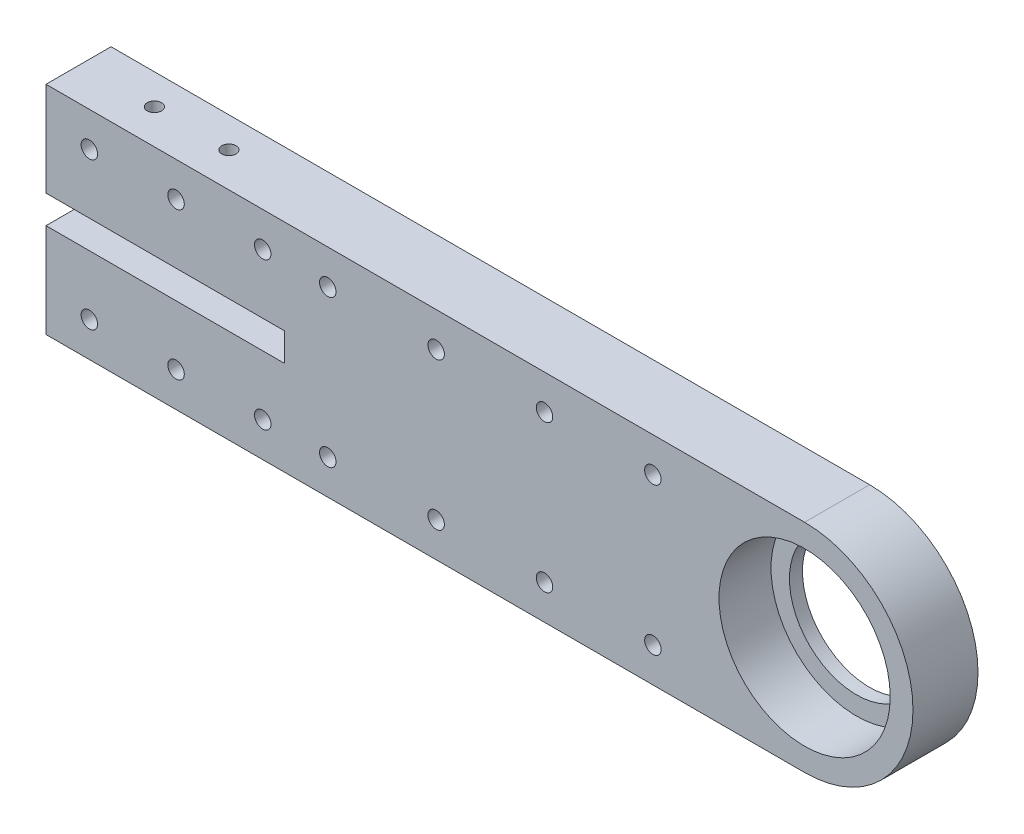
ISO-10303-21;
HEADER;
FILE_DESCRIPTION(('STEP AP214'),'2;1');
FILE_NAME('part.step','',(''),(''),'','','');
FILE_SCHEMA(('AUTOMOTIVE_DESIGN { 1 0 10303 214 1 1 1 1 }'));
ENDSEC;
DATA;
#1=APPLICATION_CONTEXT('core data for automotive mechanical design processes');
#2=APPLICATION_PROTOCOL_DEFINITION('international standard','automotive_design',2000,#1);
#3=PRODUCT_CONTEXT('',#1,'mechanical');
#4=PRODUCT('Part','Part','',(#3));
#5=PRODUCT_RELATED_PRODUCT_CATEGORY('part','',(#4));
#6=PRODUCT_DEFINITION_FORMATION('','',#4);
#7=PRODUCT_DEFINITION_CONTEXT('part definition',#1,'design');
#8=PRODUCT_DEFINITION('design','',#6,#7);
#9=PRODUCT_DEFINITION_SHAPE('','',#8);
#10=(LENGTH_UNIT() NAMED_UNIT(*) SI_UNIT(.MILLI.,.METRE.));
#11=(NAMED_UNIT(*) PLANE_ANGLE_UNIT() SI_UNIT($,.RADIAN.));
#12=(NAMED_UNIT(*) SI_UNIT($,.STERADIAN.) SOLID_ANGLE_UNIT());
#13=UNCERTAINTY_MEASURE_WITH_UNIT(LENGTH_MEASURE(1.E-05),#10,'distance_accuracy_value','');
#14=(GEOMETRIC_REPRESENTATION_CONTEXT(3) GLOBAL_UNCERTAINTY_ASSIGNED_CONTEXT((#13)) GLOBAL_UNIT_ASSIGNED_CONTEXT((#10,
#11,#12)) REPRESENTATION_CONTEXT('',''));
#15=CARTESIAN_POINT('',(0.,0.,0.));
#16=DIRECTION('',(0.,0.,1.));
#17=DIRECTION('',(1.,0.,0.));
#18=AXIS2_PLACEMENT_3D('',#15,#16,#17);
#19=CARTESIAN_POINT('',(0.,0.,15.));
#20=DIRECTION('',(0.,1.,0.));
#21=DIRECTION('',(-1.,0.,0.));
#22=AXIS2_PLACEMENT_3D('',#19,#20,#21);
#23=PLANE('',#22);
#24=DIRECTION('',(1.,0.,0.));
#25=VECTOR('',#24,1.);
#26=CARTESIAN_POINT('',(0.,0.,0.));
#27=LINE('',#26,#25);
#28=CARTESIAN_POINT('',(0.,0.,0.));
#29=VERTEX_POINT('',#28);
#30=CARTESIAN_POINT('',(175.,0.,0.));
#31=VERTEX_POINT('',#30);
#32=EDGE_CURVE('E141',#29,#31,#27,.T.);
#33=ORIENTED_EDGE('',*,*,#32,.T.);
#34=DIRECTION('',(0.,0.,-1.));
#35=VECTOR('',#34,1.);
#36=CARTESIAN_POINT('',(175.,0.,15.));
#37=LINE('',#36,#35);
#38=CARTESIAN_POINT('',(175.,0.,15.));
#39=VERTEX_POINT('',#38);
#40=EDGE_CURVE('E47',#39,#31,#37,.T.);
#41=ORIENTED_EDGE('',*,*,#40,.F.);
#42=DIRECTION('',(1.,0.,0.));
#43=VECTOR('',#42,1.);
#44=CARTESIAN_POINT('',(0.,0.,15.));
#45=LINE('',#44,#43);
#46=CARTESIAN_POINT('',(0.,0.,15.));
#47=VERTEX_POINT('',#46);
#48=EDGE_CURVE('E162',#47,#39,#45,.T.);
#49=ORIENTED_EDGE('',*,*,#48,.F.);
#50=DIRECTION('',(0.,0.,-1.));
#51=VECTOR('',#50,1.);
#52=CARTESIAN_POINT('',(0.,0.,15.));
#53=LINE('',#52,#51);
#54=EDGE_CURVE('E55',#47,#29,#53,.T.);
#55=ORIENTED_EDGE('',*,*,#54,.T.);
#56=EDGE_LOOP('',(#33,#41,#49,#55));
#57=FACE_BOUND('',#56,.T.);
#58=ADVANCED_FACE('F39',(#57),#23,.F.);
#59=CARTESIAN_POINT('',(175.,25.,15.));
#60=DIRECTION('',(0.,0.,-1.));
#61=DIRECTION('',(-1.,0.,0.));
#62=AXIS2_PLACEMENT_3D('',#59,#60,#61);
#63=CYLINDRICAL_SURFACE('',#62,25.);
#64=CARTESIAN_POINT('',(175.,25.,0.));
#65=DIRECTION('',(0.,0.,1.));
#66=DIRECTION('',(1.,0.,0.));
#67=AXIS2_PLACEMENT_3D('',#64,#65,#66);
#68=CIRCLE('',#67,25.);
#69=CARTESIAN_POINT('',(175.,50.,0.));
#70=VERTEX_POINT('',#69);
#71=EDGE_CURVE('E143',#31,#70,#68,.T.);
#72=ORIENTED_EDGE('',*,*,#71,.T.);
#73=DIRECTION('',(0.,0.,-1.));
#74=VECTOR('',#73,1.);
#75=CARTESIAN_POINT('',(175.,50.,15.));
#76=LINE('',#75,#74);
#77=CARTESIAN_POINT('',(175.,50.,15.));
#78=VERTEX_POINT('',#77);
#79=EDGE_CURVE('E170',#78,#70,#76,.T.);
#80=ORIENTED_EDGE('',*,*,#79,.F.);
#81=CARTESIAN_POINT('',(175.,25.,15.));
#82=DIRECTION('',(0.,0.,1.));
#83=DIRECTION('',(1.,0.,0.));
#84=AXIS2_PLACEMENT_3D('',#81,#82,#83);
#85=CIRCLE('',#84,25.);
#86=EDGE_CURVE('E94',#39,#78,#85,.T.);
#87=ORIENTED_EDGE('',*,*,#86,.F.);
#88=ORIENTED_EDGE('',*,*,#40,.T.);
#89=EDGE_LOOP('',(#72,#80,#87,#88));
#90=FACE_BOUND('',#89,.T.);
#91=ADVANCED_FACE('F172',(#90),#63,.T.);
#92=CARTESIAN_POINT('',(0.,50.,15.));
#93=DIRECTION('',(0.,1.,0.));
#94=DIRECTION('',(-1.,0.,0.));
#95=AXIS2_PLACEMENT_3D('',#92,#93,#94);
#96=PLANE('',#95);
#97=CARTESIAN_POINT('',(17.,50.,7.));
#98=DIRECTION('',(0.,1.,0.));
#99=DIRECTION('',(0.,0.,1.));
#100=AXIS2_PLACEMENT_3D('',#97,#98,#99);
#101=CIRCLE('',#100,1.65);
#102=CARTESIAN_POINT('',(17.,50.,8.65));
#103=VERTEX_POINT('',#102);
#104=EDGE_CURVE('E598',#103,#103,#101,.T.);
#105=ORIENTED_EDGE('',*,*,#104,.F.);
#106=EDGE_LOOP('',(#105));
#107=FACE_BOUND('',#106,.T.);
#108=CARTESIAN_POINT('',(34.2,50.,7.));
#109=DIRECTION('',(0.,1.,0.));
#110=DIRECTION('',(0.,0.,1.));
#111=AXIS2_PLACEMENT_3D('',#108,#109,#110);
#112=CIRCLE('',#111,1.65);
#113=CARTESIAN_POINT('',(34.2,50.,8.65));
#114=VERTEX_POINT('',#113);
#115=EDGE_CURVE('E594',#114,#114,#112,.T.);
#116=ORIENTED_EDGE('',*,*,#115,.F.);
#117=EDGE_LOOP('',(#116));
#118=FACE_BOUND('',#117,.T.);
#119=DIRECTION('',(1.,0.,0.));
#120=VECTOR('',#119,1.);
#121=CARTESIAN_POINT('',(0.,50.,0.));
#122=LINE('',#121,#120);
#123=CARTESIAN_POINT('',(0.,50.,0.));
#124=VERTEX_POINT('',#123);
#125=EDGE_CURVE('E147',#124,#70,#122,.T.);
#126=ORIENTED_EDGE('',*,*,#125,.F.);
#127=DIRECTION('',(0.,0.,-1.));
#128=VECTOR('',#127,1.);
#129=CARTESIAN_POINT('',(0.,50.,15.));
#130=LINE('',#129,#128);
#131=CARTESIAN_POINT('',(0.,50.,15.));
#132=VERTEX_POINT('',#131);
#133=EDGE_CURVE('E168',#132,#124,#130,.T.);
#134=ORIENTED_EDGE('',*,*,#133,.F.);
#135=DIRECTION('',(1.,0.,0.));
#136=VECTOR('',#135,1.);
#137=CARTESIAN_POINT('',(0.,50.,15.));
#138=LINE('',#137,#136);
#139=EDGE_CURVE('E613',#132,#78,#138,.T.);
#140=ORIENTED_EDGE('',*,*,#139,.T.);
#141=ORIENTED_EDGE('',*,*,#79,.T.);
#142=EDGE_LOOP('',(#126,#134,#140,#141));
#143=FACE_BOUND('',#142,.T.);
#144=ADVANCED_FACE('F191',(#107,#118,#143),#96,.T.);
#145=CARTESIAN_POINT('',(0.,0.,15.));
#146=DIRECTION('',(-1.,0.,0.));
#147=DIRECTION('',(0.,0.,1.));
#148=AXIS2_PLACEMENT_3D('',#145,#146,#147);
#149=PLANE('',#148);
#150=DIRECTION('',(0.,1.,0.));
#151=VECTOR('',#150,1.);
#152=CARTESIAN_POINT('',(0.,0.,0.));
#153=LINE('',#152,#151);
#154=CARTESIAN_POINT('',(0.,28.25,0.));
#155=VERTEX_POINT('',#154);
#156=EDGE_CURVE('E150',#155,#124,#153,.T.);
#157=ORIENTED_EDGE('',*,*,#156,.F.);
#158=DIRECTION('',(0.,0.,-1.));
#159=VECTOR('',#158,1.);
#160=CARTESIAN_POINT('',(0.,28.25,15.));
#161=LINE('',#160,#159);
#162=CARTESIAN_POINT('',(0.,28.25,15.));
#163=VERTEX_POINT('',#162);
#164=EDGE_CURVE('E166',#163,#155,#161,.T.);
#165=ORIENTED_EDGE('',*,*,#164,.F.);
#166=DIRECTION('',(0.,1.,0.));
#167=VECTOR('',#166,1.);
#168=CARTESIAN_POINT('',(0.,0.,15.));
#169=LINE('',#168,#167);
#170=EDGE_CURVE('E616',#163,#132,#169,.T.);
#171=ORIENTED_EDGE('',*,*,#170,.T.);
#172=ORIENTED_EDGE('',*,*,#133,.T.);
#173=EDGE_LOOP('',(#157,#165,#171,#172));
#174=FACE_BOUND('',#173,.T.);
#175=ADVANCED_FACE('F195',(#174),#149,.T.);
#176=CARTESIAN_POINT('',(0.,28.25,15.));
#177=DIRECTION('',(0.,-1.,0.));
#178=DIRECTION('',(0.,0.,-1.));
#179=AXIS2_PLACEMENT_3D('',#176,#177,#178);
#180=PLANE('',#179);
#181=CARTESIAN_POINT('',(17.,28.25,7.));
#182=DIRECTION('',(0.,-1.,0.));
#183=DIRECTION('',(0.,0.,-1.));
#184=AXIS2_PLACEMENT_3D('',#181,#182,#183);
#185=CIRCLE('',#184,1.65);
#186=CARTESIAN_POINT('',(17.,28.25,5.35));
#187=VERTEX_POINT('',#186);
#188=EDGE_CURVE('E595',#187,#187,#185,.F.);
#189=ORIENTED_EDGE('',*,*,#188,.T.);
#190=EDGE_LOOP('',(#189));
#191=FACE_BOUND('',#190,.T.);
#192=CARTESIAN_POINT('',(34.2,28.25,7.));
#193=DIRECTION('',(0.,-1.,0.));
#194=DIRECTION('',(0.,0.,-1.));
#195=AXIS2_PLACEMENT_3D('',#192,#193,#194);
#196=CIRCLE('',#195,1.65);
#197=CARTESIAN_POINT('',(34.2,28.25,5.35));
#198=VERTEX_POINT('',#197);
#199=EDGE_CURVE('E599',#198,#198,#196,.F.);
#200=ORIENTED_EDGE('',*,*,#199,.T.);
#201=EDGE_LOOP('',(#200));
#202=FACE_BOUND('',#201,.T.);
#203=DIRECTION('',(-1.,0.,0.));
#204=VECTOR('',#203,1.);
#205=CARTESIAN_POINT('',(0.,28.25,0.));
#206=LINE('',#205,#204);
#207=CARTESIAN_POINT('',(55.,28.25,0.));
#208=VERTEX_POINT('',#207);
#209=EDGE_CURVE('E153',#208,#155,#206,.T.);
#210=ORIENTED_EDGE('',*,*,#209,.F.);
#211=DIRECTION('',(0.,0.,-1.));
#212=VECTOR('',#211,1.);
#213=CARTESIAN_POINT('',(55.,28.25,15.));
#214=LINE('',#213,#212);
#215=CARTESIAN_POINT('',(55.,28.25,15.));
#216=VERTEX_POINT('',#215);
#217=EDGE_CURVE('E119',#216,#208,#214,.T.);
#218=ORIENTED_EDGE('',*,*,#217,.F.);
#219=DIRECTION('',(-1.,0.,0.));
#220=VECTOR('',#219,1.);
#221=CARTESIAN_POINT('',(0.,28.25,15.));
#222=LINE('',#221,#220);
#223=EDGE_CURVE('E130',#216,#163,#222,.T.);
#224=ORIENTED_EDGE('',*,*,#223,.T.);
#225=ORIENTED_EDGE('',*,*,#164,.T.);
#226=EDGE_LOOP('',(#210,#218,#224,#225));
#227=FACE_BOUND('',#226,.T.);
#228=ADVANCED_FACE('F201',(#191,#202,#227),#180,.T.);
#229=CARTESIAN_POINT('',(55.,0.,15.));
#230=DIRECTION('',(-1.,0.,0.));
#231=DIRECTION('',(0.,0.,1.));
#232=AXIS2_PLACEMENT_3D('',#229,#230,#231);
#233=PLANE('',#232);
#234=DIRECTION('',(0.,1.,0.));
#235=VECTOR('',#234,1.);
#236=CARTESIAN_POINT('',(55.,0.,0.));
#237=LINE('',#236,#235);
#238=CARTESIAN_POINT('',(55.,21.75,0.));
#239=VERTEX_POINT('',#238);
#240=EDGE_CURVE('E115',#239,#208,#237,.T.);
#241=ORIENTED_EDGE('',*,*,#240,.F.);
#242=DIRECTION('',(0.,0.,-1.));
#243=VECTOR('',#242,1.);
#244=CARTESIAN_POINT('',(55.,21.75,15.));
#245=LINE('',#244,#243);
#246=CARTESIAN_POINT('',(55.,21.75,15.));
#247=VERTEX_POINT('',#246);
#248=EDGE_CURVE('E110',#247,#239,#245,.T.);
#249=ORIENTED_EDGE('',*,*,#248,.F.);
#250=DIRECTION('',(0.,1.,0.));
#251=VECTOR('',#250,1.);
#252=CARTESIAN_POINT('',(55.,0.,15.));
#253=LINE('',#252,#251);
#254=EDGE_CURVE('E113',#247,#216,#253,.T.);
#255=ORIENTED_EDGE('',*,*,#254,.T.);
#256=ORIENTED_EDGE('',*,*,#217,.T.);
#257=EDGE_LOOP('',(#241,#249,#255,#256));
#258=FACE_BOUND('',#257,.T.);
#259=ADVANCED_FACE('F112',(#258),#233,.T.);
#260=CARTESIAN_POINT('',(0.,21.75,15.));
#261=DIRECTION('',(0.,1.,0.));
#262=DIRECTION('',(0.,0.,1.));
#263=AXIS2_PLACEMENT_3D('',#260,#261,#262);
#264=PLANE('',#263);
#265=DIRECTION('',(1.,0.,0.));
#266=VECTOR('',#265,1.);
#267=CARTESIAN_POINT('',(0.,21.75,0.));
#268=LINE('',#267,#266);
#269=CARTESIAN_POINT('',(0.,21.75,0.));
#270=VERTEX_POINT('',#269);
#271=EDGE_CURVE('E157',#270,#239,#268,.T.);
#272=ORIENTED_EDGE('',*,*,#271,.F.);
#273=DIRECTION('',(0.,0.,-1.));
#274=VECTOR('',#273,1.);
#275=CARTESIAN_POINT('',(0.,21.75,15.));
#276=LINE('',#275,#274);
#277=CARTESIAN_POINT('',(0.,21.75,15.));
#278=VERTEX_POINT('',#277);
#279=EDGE_CURVE('E81',#278,#270,#276,.T.);
#280=ORIENTED_EDGE('',*,*,#279,.F.);
#281=DIRECTION('',(1.,0.,0.));
#282=VECTOR('',#281,1.);
#283=CARTESIAN_POINT('',(0.,21.75,15.));
#284=LINE('',#283,#282);
#285=EDGE_CURVE('E127',#278,#247,#284,.T.);
#286=ORIENTED_EDGE('',*,*,#285,.T.);
#287=ORIENTED_EDGE('',*,*,#248,.T.);
#288=EDGE_LOOP('',(#272,#280,#286,#287));
#289=FACE_BOUND('',#288,.T.);
#290=ADVANCED_FACE('F132',(#289),#264,.T.);
#291=CARTESIAN_POINT('',(0.,0.,15.));
#292=DIRECTION('',(-1.,0.,0.));
#293=DIRECTION('',(0.,0.,1.));
#294=AXIS2_PLACEMENT_3D('',#291,#292,#293);
#295=PLANE('',#294);
#296=DIRECTION('',(0.,1.,0.));
#297=VECTOR('',#296,1.);
#298=CARTESIAN_POINT('',(0.,0.,0.));
#299=LINE('',#298,#297);
#300=EDGE_CURVE('E159',#29,#270,#299,.T.);
#301=ORIENTED_EDGE('',*,*,#300,.F.);
#302=ORIENTED_EDGE('',*,*,#54,.F.);
#303=DIRECTION('',(0.,1.,0.));
#304=VECTOR('',#303,1.);
#305=CARTESIAN_POINT('',(0.,0.,15.));
#306=LINE('',#305,#304);
#307=EDGE_CURVE('E133',#47,#278,#306,.T.);
#308=ORIENTED_EDGE('',*,*,#307,.T.);
#309=ORIENTED_EDGE('',*,*,#279,.T.);
#310=EDGE_LOOP('',(#301,#302,#308,#309));
#311=FACE_BOUND('',#310,.T.);
#312=ADVANCED_FACE('F176',(#311),#295,.T.);
#313=CARTESIAN_POINT('',(175.,25.,15.));
#314=DIRECTION('',(0.,0.,-1.));
#315=DIRECTION('',(-1.,0.,0.));
#316=AXIS2_PLACEMENT_3D('',#313,#314,#315);
#317=CYLINDRICAL_SURFACE('',#316,19.75);
#318=CARTESIAN_POINT('',(175.,25.,3.));
#319=DIRECTION('',(0.,0.,1.));
#320=DIRECTION('',(1.,0.,0.));
#321=AXIS2_PLACEMENT_3D('',#318,#319,#320);
#322=CIRCLE('',#321,19.75);
#323=CARTESIAN_POINT('',(194.75,25.,3.));
#324=VERTEX_POINT('',#323);
#325=EDGE_CURVE('E11',#324,#324,#322,.T.);
#326=ORIENTED_EDGE('',*,*,#325,.F.);
#327=EDGE_LOOP('',(#326));
#328=FACE_BOUND('',#327,.T.);
#329=CARTESIAN_POINT('',(175.,25.,15.));
#330=DIRECTION('',(0.,0.,1.));
#331=DIRECTION('',(1.,0.,0.));
#332=AXIS2_PLACEMENT_3D('',#329,#330,#331);
#333=CIRCLE('',#332,19.75);
#334=CARTESIAN_POINT('',(194.75,25.,15.));
#335=VERTEX_POINT('',#334);
#336=EDGE_CURVE('E135',#335,#335,#333,.T.);
#337=ORIENTED_EDGE('',*,*,#336,.T.);
#338=EDGE_LOOP('',(#337));
#339=FACE_BOUND('',#338,.T.);
#340=ADVANCED_FACE('F178',(#328,#339),#317,.F.);
#341=CARTESIAN_POINT('',(0.,0.,15.));
#342=DIRECTION('',(0.,0.,1.));
#343=DIRECTION('',(1.,0.,0.));
#344=AXIS2_PLACEMENT_3D('',#341,#342,#343);
#345=PLANE('',#344);
#346=CARTESIAN_POINT('',(90.,8.,15.));
#347=DIRECTION('',(0.,0.,1.));
#348=DIRECTION('',(1.,0.,0.));
#349=AXIS2_PLACEMENT_3D('',#346,#347,#348);
#350=CIRCLE('',#349,1.9);
#351=CARTESIAN_POINT('',(91.9,8.,15.));
#352=VERTEX_POINT('',#351);
#353=EDGE_CURVE('E526',#352,#352,#350,.T.);
#354=ORIENTED_EDGE('',*,*,#353,.F.);
#355=EDGE_LOOP('',(#354));
#356=FACE_BOUND('',#355,.T.);
#357=CARTESIAN_POINT('',(115.,8.,15.));
#358=DIRECTION('',(0.,0.,1.));
#359=DIRECTION('',(1.,0.,0.));
#360=AXIS2_PLACEMENT_3D('',#357,#358,#359);
#361=CIRCLE('',#360,1.9);
#362=CARTESIAN_POINT('',(116.9,8.,15.));
#363=VERTEX_POINT('',#362);
#364=EDGE_CURVE('E532',#363,#363,#361,.T.);
#365=ORIENTED_EDGE('',*,*,#364,.F.);
#366=EDGE_LOOP('',(#365));
#367=FACE_BOUND('',#366,.T.);
#368=CARTESIAN_POINT('',(140.,8.,15.));
#369=DIRECTION('',(0.,0.,1.));
#370=DIRECTION('',(1.,0.,0.));
#371=AXIS2_PLACEMENT_3D('',#368,#369,#370);
#372=CIRCLE('',#371,1.9);
#373=CARTESIAN_POINT('',(141.9,8.,15.));
#374=VERTEX_POINT('',#373);
#375=EDGE_CURVE('E543',#374,#374,#372,.T.);
#376=ORIENTED_EDGE('',*,*,#375,.F.);
#377=EDGE_LOOP('',(#376));
#378=FACE_BOUND('',#377,.T.);
#379=CARTESIAN_POINT('',(140.,42.,15.));
#380=DIRECTION('',(0.,0.,1.));
#381=DIRECTION('',(-1.,0.,0.));
#382=AXIS2_PLACEMENT_3D('',#379,#380,#381);
#383=CIRCLE('',#382,1.9);
#384=CARTESIAN_POINT('',(138.1,42.,15.));
#385=VERTEX_POINT('',#384);
#386=EDGE_CURVE('E549',#385,#385,#383,.T.);
#387=ORIENTED_EDGE('',*,*,#386,.F.);
#388=EDGE_LOOP('',(#387));
#389=FACE_BOUND('',#388,.T.);
#390=CARTESIAN_POINT('',(115.,42.,15.));
#391=DIRECTION('',(0.,0.,1.));
#392=DIRECTION('',(-1.,0.,0.));
#393=AXIS2_PLACEMENT_3D('',#390,#391,#392);
#394=CIRCLE('',#393,1.9);
#395=CARTESIAN_POINT('',(113.1,42.,15.));
#396=VERTEX_POINT('',#395);
#397=EDGE_CURVE('E555',#396,#396,#394,.T.);
#398=ORIENTED_EDGE('',*,*,#397,.F.);
#399=EDGE_LOOP('',(#398));
#400=FACE_BOUND('',#399,.T.);
#401=CARTESIAN_POINT('',(90.,42.,15.));
#402=DIRECTION('',(0.,0.,1.));
#403=DIRECTION('',(-1.,0.,0.));
#404=AXIS2_PLACEMENT_3D('',#401,#402,#403);
#405=CIRCLE('',#404,1.9);
#406=CARTESIAN_POINT('',(88.1,42.,15.));
#407=VERTEX_POINT('',#406);
#408=EDGE_CURVE('E682',#407,#407,#405,.T.);
#409=ORIENTED_EDGE('',*,*,#408,.F.);
#410=EDGE_LOOP('',(#409));
#411=FACE_BOUND('',#410,.T.);
#412=CARTESIAN_POINT('',(65.,42.,15.));
#413=DIRECTION('',(0.,0.,1.));
#414=DIRECTION('',(-1.,0.,0.));
#415=AXIS2_PLACEMENT_3D('',#412,#413,#414);
#416=CIRCLE('',#415,1.9);
#417=CARTESIAN_POINT('',(63.1,42.,15.));
#418=VERTEX_POINT('',#417);
#419=EDGE_CURVE('E689',#418,#418,#416,.T.);
#420=ORIENTED_EDGE('',*,*,#419,.F.);
#421=EDGE_LOOP('',(#420));
#422=FACE_BOUND('',#421,.T.);
#423=CARTESIAN_POINT('',(65.,8.,15.));
#424=DIRECTION('',(0.,0.,1.));
#425=DIRECTION('',(1.,0.,0.));
#426=AXIS2_PLACEMENT_3D('',#423,#424,#425);
#427=CIRCLE('',#426,1.9);
#428=CARTESIAN_POINT('',(66.9,8.,15.));
#429=VERTEX_POINT('',#428);
#430=EDGE_CURVE('E527',#429,#429,#427,.T.);
#431=ORIENTED_EDGE('',*,*,#430,.F.);
#432=EDGE_LOOP('',(#431));
#433=FACE_BOUND('',#432,.T.);
#434=CARTESIAN_POINT('',(50.,42.,15.));
#435=DIRECTION('',(0.,0.,-1.));
#436=DIRECTION('',(-1.,0.,0.));
#437=AXIS2_PLACEMENT_3D('',#434,#435,#436);
#438=CIRCLE('',#437,1.9);
#439=CARTESIAN_POINT('',(48.1,42.,15.));
#440=VERTEX_POINT('',#439);
#441=EDGE_CURVE('E561',#440,#440,#438,.T.);
#442=ORIENTED_EDGE('',*,*,#441,.T.);
#443=EDGE_LOOP('',(#442));
#444=FACE_BOUND('',#443,.T.);
#445=CARTESIAN_POINT('',(30.,42.,15.));
#446=DIRECTION('',(0.,0.,-1.));
#447=DIRECTION('',(-1.,0.,0.));
#448=AXIS2_PLACEMENT_3D('',#445,#446,#447);
#449=CIRCLE('',#448,1.9);
#450=CARTESIAN_POINT('',(28.1,42.,15.));
#451=VERTEX_POINT('',#450);
#452=EDGE_CURVE('E567',#451,#451,#449,.T.);
#453=ORIENTED_EDGE('',*,*,#452,.T.);
#454=EDGE_LOOP('',(#453));
#455=FACE_BOUND('',#454,.T.);
#456=CARTESIAN_POINT('',(10.,42.,15.));
#457=DIRECTION('',(0.,0.,-1.));
#458=DIRECTION('',(-1.,0.,0.));
#459=AXIS2_PLACEMENT_3D('',#456,#457,#458);
#460=CIRCLE('',#459,1.9);
#461=CARTESIAN_POINT('',(8.1,42.,15.));
#462=VERTEX_POINT('',#461);
#463=EDGE_CURVE('E573',#462,#462,#460,.T.);
#464=ORIENTED_EDGE('',*,*,#463,.T.);
#465=EDGE_LOOP('',(#464));
#466=FACE_BOUND('',#465,.T.);
#467=CARTESIAN_POINT('',(10.,8.,15.));
#468=DIRECTION('',(0.,0.,-1.));
#469=DIRECTION('',(-1.,0.,0.));
#470=AXIS2_PLACEMENT_3D('',#467,#468,#469);
#471=CIRCLE('',#470,1.9);
#472=CARTESIAN_POINT('',(8.1,8.,15.));
#473=VERTEX_POINT('',#472);
#474=EDGE_CURVE('E579',#473,#473,#471,.T.);
#475=ORIENTED_EDGE('',*,*,#474,.T.);
#476=EDGE_LOOP('',(#475));
#477=FACE_BOUND('',#476,.T.);
#478=CARTESIAN_POINT('',(30.,8.,15.));
#479=DIRECTION('',(0.,0.,-1.));
#480=DIRECTION('',(-1.,0.,0.));
#481=AXIS2_PLACEMENT_3D('',#478,#479,#480);
#482=CIRCLE('',#481,1.9);
#483=CARTESIAN_POINT('',(28.1,8.,15.));
#484=VERTEX_POINT('',#483);
#485=EDGE_CURVE('E585',#484,#484,#482,.T.);
#486=ORIENTED_EDGE('',*,*,#485,.T.);
#487=EDGE_LOOP('',(#486));
#488=FACE_BOUND('',#487,.T.);
#489=CARTESIAN_POINT('',(50.,8.,15.));
#490=DIRECTION('',(0.,0.,-1.));
#491=DIRECTION('',(-1.,0.,0.));
#492=AXIS2_PLACEMENT_3D('',#489,#490,#491);
#493=CIRCLE('',#492,1.9);
#494=CARTESIAN_POINT('',(48.1,8.,15.));
#495=VERTEX_POINT('',#494);
#496=EDGE_CURVE('E591',#495,#495,#493,.T.);
#497=ORIENTED_EDGE('',*,*,#496,.T.);
#498=EDGE_LOOP('',(#497));
#499=FACE_BOUND('',#498,.T.);
#500=ORIENTED_EDGE('',*,*,#48,.T.);
#501=ORIENTED_EDGE('',*,*,#86,.T.);
#502=ORIENTED_EDGE('',*,*,#139,.F.);
#503=ORIENTED_EDGE('',*,*,#170,.F.);
#504=ORIENTED_EDGE('',*,*,#223,.F.);
#505=ORIENTED_EDGE('',*,*,#254,.F.);
#506=ORIENTED_EDGE('',*,*,#285,.F.);
#507=ORIENTED_EDGE('',*,*,#307,.F.);
#508=EDGE_LOOP('',(#500,#501,#502,#503,#504,#505,#506,#507));
#509=FACE_BOUND('',#508,.T.);
#510=ORIENTED_EDGE('',*,*,#336,.F.);
#511=EDGE_LOOP('',(#510));
#512=FACE_BOUND('',#511,.T.);
#513=ADVANCED_FACE('F124',(#356,#367,#378,#389,#400,#411,#422,#433,#444,#455,#466,#477,#488,
#499,#509,#512),#345,.T.);
#514=CARTESIAN_POINT('',(0.,0.,0.));
#515=DIRECTION('',(0.,0.,1.));
#516=DIRECTION('',(1.,0.,0.));
#517=AXIS2_PLACEMENT_3D('',#514,#515,#516);
#518=PLANE('',#517);
#519=CARTESIAN_POINT('',(90.,8.,0.));
#520=DIRECTION('',(0.,0.,1.));
#521=DIRECTION('',(1.,0.,0.));
#522=AXIS2_PLACEMENT_3D('',#519,#520,#521);
#523=CIRCLE('',#522,1.9);
#524=CARTESIAN_POINT('',(91.9,8.,0.));
#525=VERTEX_POINT('',#524);
#526=EDGE_CURVE('E523',#525,#525,#523,.T.);
#527=ORIENTED_EDGE('',*,*,#526,.T.);
#528=EDGE_LOOP('',(#527));
#529=FACE_BOUND('',#528,.T.);
#530=CARTESIAN_POINT('',(115.,8.,0.));
#531=DIRECTION('',(0.,0.,1.));
#532=DIRECTION('',(1.,0.,0.));
#533=AXIS2_PLACEMENT_3D('',#530,#531,#532);
#534=CIRCLE('',#533,1.9);
#535=CARTESIAN_POINT('',(116.9,8.,0.));
#536=VERTEX_POINT('',#535);
#537=EDGE_CURVE('E540',#536,#536,#534,.T.);
#538=ORIENTED_EDGE('',*,*,#537,.T.);
#539=EDGE_LOOP('',(#538));
#540=FACE_BOUND('',#539,.T.);
#541=CARTESIAN_POINT('',(140.,8.,0.));
#542=DIRECTION('',(0.,0.,1.));
#543=DIRECTION('',(1.,0.,0.));
#544=AXIS2_PLACEMENT_3D('',#541,#542,#543);
#545=CIRCLE('',#544,1.9);
#546=CARTESIAN_POINT('',(141.9,8.,0.));
#547=VERTEX_POINT('',#546);
#548=EDGE_CURVE('E546',#547,#547,#545,.T.);
#549=ORIENTED_EDGE('',*,*,#548,.T.);
#550=EDGE_LOOP('',(#549));
#551=FACE_BOUND('',#550,.T.);
#552=CARTESIAN_POINT('',(140.,42.,0.));
#553=DIRECTION('',(0.,0.,1.));
#554=DIRECTION('',(-1.,0.,0.));
#555=AXIS2_PLACEMENT_3D('',#552,#553,#554);
#556=CIRCLE('',#555,1.9);
#557=CARTESIAN_POINT('',(138.1,42.,0.));
#558=VERTEX_POINT('',#557);
#559=EDGE_CURVE('E552',#558,#558,#556,.T.);
#560=ORIENTED_EDGE('',*,*,#559,.T.);
#561=EDGE_LOOP('',(#560));
#562=FACE_BOUND('',#561,.T.);
#563=CARTESIAN_POINT('',(115.,42.,0.));
#564=DIRECTION('',(0.,0.,1.));
#565=DIRECTION('',(-1.,0.,0.));
#566=AXIS2_PLACEMENT_3D('',#563,#564,#565);
#567=CIRCLE('',#566,1.9);
#568=CARTESIAN_POINT('',(113.1,42.,0.));
#569=VERTEX_POINT('',#568);
#570=EDGE_CURVE('E677',#569,#569,#567,.T.);
#571=ORIENTED_EDGE('',*,*,#570,.T.);
#572=EDGE_LOOP('',(#571));
#573=FACE_BOUND('',#572,.T.);
#574=CARTESIAN_POINT('',(90.,42.,0.));
#575=DIRECTION('',(0.,0.,1.));
#576=DIRECTION('',(-1.,0.,0.));
#577=AXIS2_PLACEMENT_3D('',#574,#575,#576);
#578=CIRCLE('',#577,1.9);
#579=CARTESIAN_POINT('',(88.1,42.,0.));
#580=VERTEX_POINT('',#579);
#581=EDGE_CURVE('E687',#580,#580,#578,.T.);
#582=ORIENTED_EDGE('',*,*,#581,.T.);
#583=EDGE_LOOP('',(#582));
#584=FACE_BOUND('',#583,.T.);
#585=CARTESIAN_POINT('',(65.,42.,0.));
#586=DIRECTION('',(0.,0.,1.));
#587=DIRECTION('',(-1.,0.,0.));
#588=AXIS2_PLACEMENT_3D('',#585,#586,#587);
#589=CIRCLE('',#588,1.9);
#590=CARTESIAN_POINT('',(63.1,42.,0.));
#591=VERTEX_POINT('',#590);
#592=EDGE_CURVE('E535',#591,#591,#589,.T.);
#593=ORIENTED_EDGE('',*,*,#592,.T.);
#594=EDGE_LOOP('',(#593));
#595=FACE_BOUND('',#594,.T.);
#596=CARTESIAN_POINT('',(65.,8.,0.));
#597=DIRECTION('',(0.,0.,1.));
#598=DIRECTION('',(1.,0.,0.));
#599=AXIS2_PLACEMENT_3D('',#596,#597,#598);
#600=CIRCLE('',#599,1.9);
#601=CARTESIAN_POINT('',(66.9,8.,0.));
#602=VERTEX_POINT('',#601);
#603=EDGE_CURVE('E530',#602,#602,#600,.T.);
#604=ORIENTED_EDGE('',*,*,#603,.T.);
#605=EDGE_LOOP('',(#604));
#606=FACE_BOUND('',#605,.T.);
#607=CARTESIAN_POINT('',(50.,42.,0.));
#608=DIRECTION('',(0.,0.,-1.));
#609=DIRECTION('',(-1.,0.,0.));
#610=AXIS2_PLACEMENT_3D('',#607,#608,#609);
#611=CIRCLE('',#610,1.9);
#612=CARTESIAN_POINT('',(48.1,42.,0.));
#613=VERTEX_POINT('',#612);
#614=EDGE_CURVE('E557',#613,#613,#611,.T.);
#615=ORIENTED_EDGE('',*,*,#614,.F.);
#616=EDGE_LOOP('',(#615));
#617=FACE_BOUND('',#616,.T.);
#618=CARTESIAN_POINT('',(30.,42.,0.));
#619=DIRECTION('',(0.,0.,-1.));
#620=DIRECTION('',(-1.,0.,0.));
#621=AXIS2_PLACEMENT_3D('',#618,#619,#620);
#622=CIRCLE('',#621,1.9);
#623=CARTESIAN_POINT('',(28.1,42.,0.));
#624=VERTEX_POINT('',#623);
#625=EDGE_CURVE('E564',#624,#624,#622,.T.);
#626=ORIENTED_EDGE('',*,*,#625,.F.);
#627=EDGE_LOOP('',(#626));
#628=FACE_BOUND('',#627,.T.);
#629=CARTESIAN_POINT('',(10.,42.,0.));
#630=DIRECTION('',(0.,0.,-1.));
#631=DIRECTION('',(-1.,0.,0.));
#632=AXIS2_PLACEMENT_3D('',#629,#630,#631);
#633=CIRCLE('',#632,1.9);
#634=CARTESIAN_POINT('',(8.1,42.,0.));
#635=VERTEX_POINT('',#634);
#636=EDGE_CURVE('E570',#635,#635,#633,.T.);
#637=ORIENTED_EDGE('',*,*,#636,.F.);
#638=EDGE_LOOP('',(#637));
#639=FACE_BOUND('',#638,.T.);
#640=CARTESIAN_POINT('',(10.,8.,0.));
#641=DIRECTION('',(0.,0.,-1.));
#642=DIRECTION('',(-1.,0.,0.));
#643=AXIS2_PLACEMENT_3D('',#640,#641,#642);
#644=CIRCLE('',#643,1.9);
#645=CARTESIAN_POINT('',(8.1,8.,0.));
#646=VERTEX_POINT('',#645);
#647=EDGE_CURVE('E576',#646,#646,#644,.T.);
#648=ORIENTED_EDGE('',*,*,#647,.F.);
#649=EDGE_LOOP('',(#648));
#650=FACE_BOUND('',#649,.T.);
#651=CARTESIAN_POINT('',(30.,8.,0.));
#652=DIRECTION('',(0.,0.,-1.));
#653=DIRECTION('',(-1.,0.,0.));
#654=AXIS2_PLACEMENT_3D('',#651,#652,#653);
#655=CIRCLE('',#654,1.9);
#656=CARTESIAN_POINT('',(28.1,8.,0.));
#657=VERTEX_POINT('',#656);
#658=EDGE_CURVE('E582',#657,#657,#655,.T.);
#659=ORIENTED_EDGE('',*,*,#658,.F.);
#660=EDGE_LOOP('',(#659));
#661=FACE_BOUND('',#660,.T.);
#662=CARTESIAN_POINT('',(50.,8.,0.));
#663=DIRECTION('',(0.,0.,-1.));
#664=DIRECTION('',(-1.,0.,0.));
#665=AXIS2_PLACEMENT_3D('',#662,#663,#664);
#666=CIRCLE('',#665,1.9);
#667=CARTESIAN_POINT('',(48.1,8.,0.));
#668=VERTEX_POINT('',#667);
#669=EDGE_CURVE('E588',#668,#668,#666,.T.);
#670=ORIENTED_EDGE('',*,*,#669,.F.);
#671=EDGE_LOOP('',(#670));
#672=FACE_BOUND('',#671,.T.);
#673=ORIENTED_EDGE('',*,*,#32,.F.);
#674=ORIENTED_EDGE('',*,*,#300,.T.);
#675=ORIENTED_EDGE('',*,*,#271,.T.);
#676=ORIENTED_EDGE('',*,*,#240,.T.);
#677=ORIENTED_EDGE('',*,*,#209,.T.);
#678=ORIENTED_EDGE('',*,*,#156,.T.);
#679=ORIENTED_EDGE('',*,*,#125,.T.);
#680=ORIENTED_EDGE('',*,*,#71,.F.);
#681=EDGE_LOOP('',(#673,#674,#675,#676,#677,#678,#679,#680));
#682=FACE_BOUND('',#681,.T.);
#683=CARTESIAN_POINT('',(175.,25.,0.));
#684=DIRECTION('',(0.,0.,1.));
#685=DIRECTION('',(1.,0.,0.));
#686=AXIS2_PLACEMENT_3D('',#683,#684,#685);
#687=CIRCLE('',#686,15.5);
#688=CARTESIAN_POINT('',(190.5,25.,0.));
#689=VERTEX_POINT('',#688);
#690=EDGE_CURVE('E602',#689,#689,#687,.T.);
#691=ORIENTED_EDGE('',*,*,#690,.T.);
#692=EDGE_LOOP('',(#691));
#693=FACE_BOUND('',#692,.T.);
#694=ADVANCED_FACE('F174',(#529,#540,#551,#562,#573,#584,#595,#606,#617,#628,#639,#650,#661,
#672,#682,#693),#518,.F.);
#695=CARTESIAN_POINT('',(175.,25.,3.));
#696=DIRECTION('',(0.,0.,-1.));
#697=DIRECTION('',(-1.,0.,0.));
#698=AXIS2_PLACEMENT_3D('',#695,#696,#697);
#699=CYLINDRICAL_SURFACE('',#698,15.5);
#700=CARTESIAN_POINT('',(175.,25.,3.));
#701=DIRECTION('',(0.,0.,1.));
#702=DIRECTION('',(1.,0.,0.));
#703=AXIS2_PLACEMENT_3D('',#700,#701,#702);
#704=CIRCLE('',#703,15.5);
#705=CARTESIAN_POINT('',(190.5,25.,3.));
#706=VERTEX_POINT('',#705);
#707=EDGE_CURVE('E144',#706,#706,#704,.T.);
#708=ORIENTED_EDGE('',*,*,#707,.T.);
#709=EDGE_LOOP('',(#708));
#710=FACE_BOUND('',#709,.T.);
#711=ORIENTED_EDGE('',*,*,#690,.F.);
#712=EDGE_LOOP('',(#711));
#713=FACE_BOUND('',#712,.T.);
#714=ADVANCED_FACE('F236',(#710,#713),#699,.F.);
#715=CARTESIAN_POINT('',(0.,0.,3.));
#716=DIRECTION('',(0.,0.,1.));
#717=DIRECTION('',(1.,0.,0.));
#718=AXIS2_PLACEMENT_3D('',#715,#716,#717);
#719=PLANE('',#718);
#720=ORIENTED_EDGE('',*,*,#707,.F.);
#721=EDGE_LOOP('',(#720));
#722=FACE_BOUND('',#721,.T.);
#723=ORIENTED_EDGE('',*,*,#325,.T.);
#724=EDGE_LOOP('',(#723));
#725=FACE_BOUND('',#724,.T.);
#726=ADVANCED_FACE('F241',(#722,#725),#719,.T.);
#727=CARTESIAN_POINT('',(34.2,-0.001000000000001,7.));
#728=DIRECTION('',(0.,1.,0.));
#729=DIRECTION('',(0.,0.,1.));
#730=AXIS2_PLACEMENT_3D('',#727,#728,#729);
#731=CYLINDRICAL_SURFACE('',#730,1.65);
#732=ORIENTED_EDGE('',*,*,#199,.F.);
#733=EDGE_LOOP('',(#732));
#734=FACE_BOUND('',#733,.T.);
#735=ORIENTED_EDGE('',*,*,#115,.T.);
#736=EDGE_LOOP('',(#735));
#737=FACE_BOUND('',#736,.T.);
#738=ADVANCED_FACE('F254',(#734,#737),#731,.F.);
#739=CARTESIAN_POINT('',(17.,-0.001000000000001,7.));
#740=DIRECTION('',(0.,1.,0.));
#741=DIRECTION('',(0.,0.,1.));
#742=AXIS2_PLACEMENT_3D('',#739,#740,#741);
#743=CYLINDRICAL_SURFACE('',#742,1.65);
#744=ORIENTED_EDGE('',*,*,#188,.F.);
#745=EDGE_LOOP('',(#744));
#746=FACE_BOUND('',#745,.T.);
#747=ORIENTED_EDGE('',*,*,#104,.T.);
#748=EDGE_LOOP('',(#747));
#749=FACE_BOUND('',#748,.T.);
#750=ADVANCED_FACE('F279',(#746,#749),#743,.F.);
#751=CARTESIAN_POINT('',(50.,8.,0.));
#752=DIRECTION('',(0.,0.,-1.));
#753=DIRECTION('',(-1.,0.,0.));
#754=AXIS2_PLACEMENT_3D('',#751,#752,#753);
#755=CYLINDRICAL_SURFACE('',#754,1.9);
#756=ORIENTED_EDGE('',*,*,#496,.F.);
#757=EDGE_LOOP('',(#756));
#758=FACE_BOUND('',#757,.T.);
#759=ORIENTED_EDGE('',*,*,#669,.T.);
#760=EDGE_LOOP('',(#759));
#761=FACE_BOUND('',#760,.T.);
#762=ADVANCED_FACE('F290',(#758,#761),#755,.F.);
#763=CARTESIAN_POINT('',(30.,8.,0.));
#764=DIRECTION('',(0.,0.,-1.));
#765=DIRECTION('',(-1.,0.,0.));
#766=AXIS2_PLACEMENT_3D('',#763,#764,#765);
#767=CYLINDRICAL_SURFACE('',#766,1.9);
#768=ORIENTED_EDGE('',*,*,#485,.F.);
#769=EDGE_LOOP('',(#768));
#770=FACE_BOUND('',#769,.T.);
#771=ORIENTED_EDGE('',*,*,#658,.T.);
#772=EDGE_LOOP('',(#771));
#773=FACE_BOUND('',#772,.T.);
#774=ADVANCED_FACE('F301',(#770,#773),#767,.F.);
#775=CARTESIAN_POINT('',(10.,8.,0.));
#776=DIRECTION('',(0.,0.,-1.));
#777=DIRECTION('',(-1.,0.,0.));
#778=AXIS2_PLACEMENT_3D('',#775,#776,#777);
#779=CYLINDRICAL_SURFACE('',#778,1.9);
#780=ORIENTED_EDGE('',*,*,#474,.F.);
#781=EDGE_LOOP('',(#780));
#782=FACE_BOUND('',#781,.T.);
#783=ORIENTED_EDGE('',*,*,#647,.T.);
#784=EDGE_LOOP('',(#783));
#785=FACE_BOUND('',#784,.T.);
#786=ADVANCED_FACE('F312',(#782,#785),#779,.F.);
#787=CARTESIAN_POINT('',(10.,42.,0.));
#788=DIRECTION('',(0.,0.,-1.));
#789=DIRECTION('',(-1.,0.,0.));
#790=AXIS2_PLACEMENT_3D('',#787,#788,#789);
#791=CYLINDRICAL_SURFACE('',#790,1.9);
#792=ORIENTED_EDGE('',*,*,#463,.F.);
#793=EDGE_LOOP('',(#792));
#794=FACE_BOUND('',#793,.T.);
#795=ORIENTED_EDGE('',*,*,#636,.T.);
#796=EDGE_LOOP('',(#795));
#797=FACE_BOUND('',#796,.T.);
#798=ADVANCED_FACE('F323',(#794,#797),#791,.F.);
#799=CARTESIAN_POINT('',(30.,42.,0.));
#800=DIRECTION('',(0.,0.,-1.));
#801=DIRECTION('',(-1.,0.,0.));
#802=AXIS2_PLACEMENT_3D('',#799,#800,#801);
#803=CYLINDRICAL_SURFACE('',#802,1.9);
#804=ORIENTED_EDGE('',*,*,#452,.F.);
#805=EDGE_LOOP('',(#804));
#806=FACE_BOUND('',#805,.T.);
#807=ORIENTED_EDGE('',*,*,#625,.T.);
#808=EDGE_LOOP('',(#807));
#809=FACE_BOUND('',#808,.T.);
#810=ADVANCED_FACE('F334',(#806,#809),#803,.F.);
#811=CARTESIAN_POINT('',(50.,42.,0.));
#812=DIRECTION('',(0.,0.,-1.));
#813=DIRECTION('',(-1.,0.,0.));
#814=AXIS2_PLACEMENT_3D('',#811,#812,#813);
#815=CYLINDRICAL_SURFACE('',#814,1.9);
#816=ORIENTED_EDGE('',*,*,#441,.F.);
#817=EDGE_LOOP('',(#816));
#818=FACE_BOUND('',#817,.T.);
#819=ORIENTED_EDGE('',*,*,#614,.T.);
#820=EDGE_LOOP('',(#819));
#821=FACE_BOUND('',#820,.T.);
#822=ADVANCED_FACE('F345',(#818,#821),#815,.F.);
#823=CARTESIAN_POINT('',(65.,8.,0.));
#824=DIRECTION('',(0.,0.,1.));
#825=DIRECTION('',(1.,0.,0.));
#826=AXIS2_PLACEMENT_3D('',#823,#824,#825);
#827=CYLINDRICAL_SURFACE('',#826,1.9);
#828=ORIENTED_EDGE('',*,*,#603,.F.);
#829=EDGE_LOOP('',(#828));
#830=FACE_BOUND('',#829,.T.);
#831=ORIENTED_EDGE('',*,*,#430,.T.);
#832=EDGE_LOOP('',(#831));
#833=FACE_BOUND('',#832,.T.);
#834=ADVANCED_FACE('F356',(#830,#833),#827,.F.);
#835=CARTESIAN_POINT('',(65.,42.,0.));
#836=DIRECTION('',(0.,0.,1.));
#837=DIRECTION('',(1.,0.,0.));
#838=AXIS2_PLACEMENT_3D('',#835,#836,#837);
#839=CYLINDRICAL_SURFACE('',#838,1.9);
#840=ORIENTED_EDGE('',*,*,#592,.F.);
#841=EDGE_LOOP('',(#840));
#842=FACE_BOUND('',#841,.T.);
#843=ORIENTED_EDGE('',*,*,#419,.T.);
#844=EDGE_LOOP('',(#843));
#845=FACE_BOUND('',#844,.T.);
#846=ADVANCED_FACE('F384',(#842,#845),#839,.F.);
#847=CARTESIAN_POINT('',(90.,42.,0.));
#848=DIRECTION('',(0.,0.,1.));
#849=DIRECTION('',(1.,0.,0.));
#850=AXIS2_PLACEMENT_3D('',#847,#848,#849);
#851=CYLINDRICAL_SURFACE('',#850,1.9);
#852=ORIENTED_EDGE('',*,*,#581,.F.);
#853=EDGE_LOOP('',(#852));
#854=FACE_BOUND('',#853,.T.);
#855=ORIENTED_EDGE('',*,*,#408,.T.);
#856=EDGE_LOOP('',(#855));
#857=FACE_BOUND('',#856,.T.);
#858=ADVANCED_FACE('F395',(#854,#857),#851,.F.);
#859=CARTESIAN_POINT('',(115.,42.,0.));
#860=DIRECTION('',(0.,0.,1.));
#861=DIRECTION('',(1.,0.,0.));
#862=AXIS2_PLACEMENT_3D('',#859,#860,#861);
#863=CYLINDRICAL_SURFACE('',#862,1.9);
#864=ORIENTED_EDGE('',*,*,#570,.F.);
#865=EDGE_LOOP('',(#864));
#866=FACE_BOUND('',#865,.T.);
#867=ORIENTED_EDGE('',*,*,#397,.T.);
#868=EDGE_LOOP('',(#867));
#869=FACE_BOUND('',#868,.T.);
#870=ADVANCED_FACE('F406',(#866,#869),#863,.F.);
#871=CARTESIAN_POINT('',(140.,42.,0.));
#872=DIRECTION('',(0.,0.,1.));
#873=DIRECTION('',(1.,0.,0.));
#874=AXIS2_PLACEMENT_3D('',#871,#872,#873);
#875=CYLINDRICAL_SURFACE('',#874,1.9);
#876=ORIENTED_EDGE('',*,*,#559,.F.);
#877=EDGE_LOOP('',(#876));
#878=FACE_BOUND('',#877,.T.);
#879=ORIENTED_EDGE('',*,*,#386,.T.);
#880=EDGE_LOOP('',(#879));
#881=FACE_BOUND('',#880,.T.);
#882=ADVANCED_FACE('F417',(#878,#881),#875,.F.);
#883=CARTESIAN_POINT('',(140.,8.,0.));
#884=DIRECTION('',(0.,0.,1.));
#885=DIRECTION('',(1.,0.,0.));
#886=AXIS2_PLACEMENT_3D('',#883,#884,#885);
#887=CYLINDRICAL_SURFACE('',#886,1.9);
#888=ORIENTED_EDGE('',*,*,#548,.F.);
#889=EDGE_LOOP('',(#888));
#890=FACE_BOUND('',#889,.T.);
#891=ORIENTED_EDGE('',*,*,#375,.T.);
#892=EDGE_LOOP('',(#891));
#893=FACE_BOUND('',#892,.T.);
#894=ADVANCED_FACE('F428',(#890,#893),#887,.F.);
#895=CARTESIAN_POINT('',(115.,8.,0.));
#896=DIRECTION('',(0.,0.,1.));
#897=DIRECTION('',(1.,0.,0.));
#898=AXIS2_PLACEMENT_3D('',#895,#896,#897);
#899=CYLINDRICAL_SURFACE('',#898,1.9);
#900=ORIENTED_EDGE('',*,*,#537,.F.);
#901=EDGE_LOOP('',(#900));
#902=FACE_BOUND('',#901,.T.);
#903=ORIENTED_EDGE('',*,*,#364,.T.);
#904=EDGE_LOOP('',(#903));
#905=FACE_BOUND('',#904,.T.);
#906=ADVANCED_FACE('F439',(#902,#905),#899,.F.);
#907=CARTESIAN_POINT('',(90.,8.,0.));
#908=DIRECTION('',(0.,0.,1.));
#909=DIRECTION('',(1.,0.,0.));
#910=AXIS2_PLACEMENT_3D('',#907,#908,#909);
#911=CYLINDRICAL_SURFACE('',#910,1.9);
#912=ORIENTED_EDGE('',*,*,#526,.F.);
#913=EDGE_LOOP('',(#912));
#914=FACE_BOUND('',#913,.T.);
#915=ORIENTED_EDGE('',*,*,#353,.T.);
#916=EDGE_LOOP('',(#915));
#917=FACE_BOUND('',#916,.T.);
#918=ADVANCED_FACE('F450',(#914,#917),#911,.F.);
#919=CLOSED_SHELL('',(#58,#91,#144,#175,#228,#259,#290,#312,#340,#513,#694,#714,#726,#738,#750,
#762,#774,#786,#798,#810,#822,#834,#846,#858,#870,#882,#894,#906,#918));
#920=MANIFOLD_SOLID_BREP('B2',#919);
#921=ADVANCED_BREP_SHAPE_REPRESENTATION('',(#18,#920),#14);
#922=SHAPE_DEFINITION_REPRESENTATION(#9,#921);
ENDSEC;
END-ISO-10303-21;
